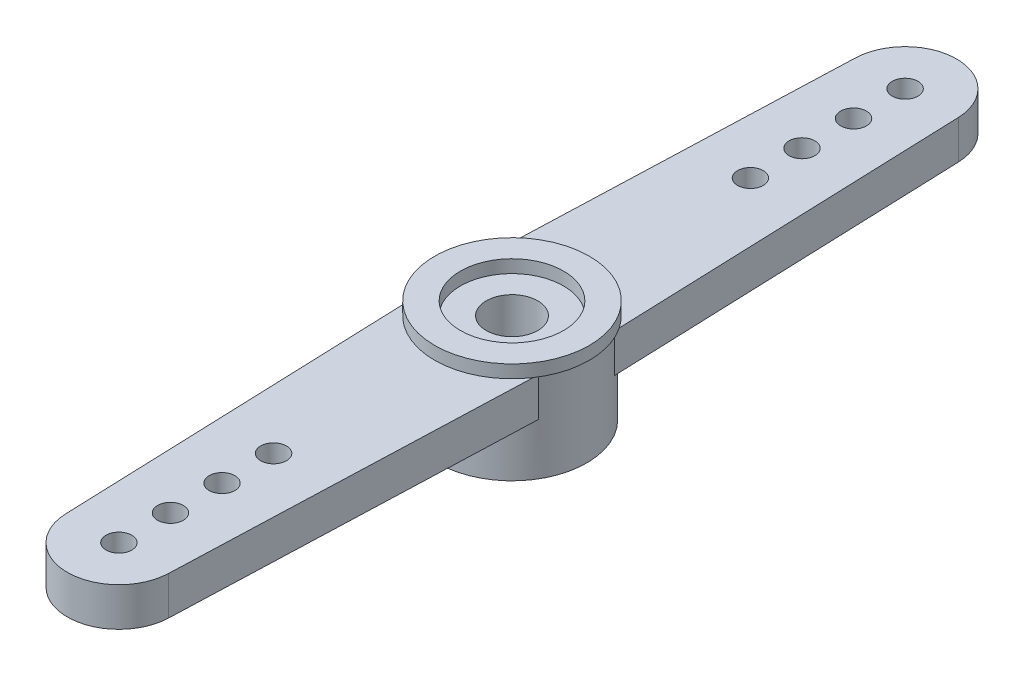
ISO-10303-21;
HEADER;
FILE_DESCRIPTION(('STEP AP214'),'2;1');
FILE_NAME('part.step','',(''),(''),'','','');
FILE_SCHEMA(('AUTOMOTIVE_DESIGN { 1 0 10303 214 1 1 1 1 }'));
ENDSEC;
DATA;
#1=APPLICATION_CONTEXT('core data for automotive mechanical design processes');
#2=APPLICATION_PROTOCOL_DEFINITION('international standard','automotive_design',2000,#1);
#3=PRODUCT_CONTEXT('',#1,'mechanical');
#4=PRODUCT('Part','Part','',(#3));
#5=PRODUCT_RELATED_PRODUCT_CATEGORY('part','',(#4));
#6=PRODUCT_DEFINITION_FORMATION('','',#4);
#7=PRODUCT_DEFINITION_CONTEXT('part definition',#1,'design');
#8=PRODUCT_DEFINITION('design','',#6,#7);
#9=PRODUCT_DEFINITION_SHAPE('','',#8);
#10=(LENGTH_UNIT() NAMED_UNIT(*) SI_UNIT(.MILLI.,.METRE.));
#11=(NAMED_UNIT(*) PLANE_ANGLE_UNIT() SI_UNIT($,.RADIAN.));
#12=(NAMED_UNIT(*) SI_UNIT($,.STERADIAN.) SOLID_ANGLE_UNIT());
#13=UNCERTAINTY_MEASURE_WITH_UNIT(LENGTH_MEASURE(1.E-05),#10,'distance_accuracy_value','');
#14=(GEOMETRIC_REPRESENTATION_CONTEXT(3) GLOBAL_UNCERTAINTY_ASSIGNED_CONTEXT((#13)) GLOBAL_UNIT_ASSIGNED_CONTEXT((#10,
#11,#12)) REPRESENTATION_CONTEXT('',''));
#15=CARTESIAN_POINT('',(0.,0.,0.));
#16=DIRECTION('',(0.,0.,1.));
#17=DIRECTION('',(1.,0.,0.));
#18=AXIS2_PLACEMENT_3D('',#15,#16,#17);
#19=CARTESIAN_POINT('',(0.,1.5,0.));
#20=DIRECTION('',(0.,1.,0.));
#21=DIRECTION('',(0.,0.,1.));
#22=AXIS2_PLACEMENT_3D('',#19,#20,#21);
#23=PLANE('',#22);
#24=CARTESIAN_POINT('',(0.,1.5,0.));
#25=DIRECTION('',(0.,1.,0.));
#26=DIRECTION('',(0.,0.,1.));
#27=AXIS2_PLACEMENT_3D('',#24,#25,#26);
#28=CIRCLE('',#27,3.);
#29=CARTESIAN_POINT('',(2.49278221920314,1.5,-1.6691425366411));
#30=VERTEX_POINT('',#29);
#31=CARTESIAN_POINT('',(-2.49278221920314,1.5,-1.6691425366411));
#32=VERTEX_POINT('',#31);
#33=EDGE_CURVE('E11',#30,#32,#28,.T.);
#34=ORIENTED_EDGE('',*,*,#33,.F.);
#35=DIRECTION('',(-0.036164986228485,0.,-0.999345832918261));
#36=VECTOR('',#35,1.);
#37=CARTESIAN_POINT('',(1.99869166583652,1.5,-15.322329972457));
#38=LINE('',#37,#36);
#39=CARTESIAN_POINT('',(1.99869166583652,1.5,-15.322329972457));
#40=VERTEX_POINT('',#39);
#41=EDGE_CURVE('E223',#30,#40,#38,.T.);
#42=ORIENTED_EDGE('',*,*,#41,.T.);
#43=CARTESIAN_POINT('',(0.,1.5,-15.25));
#44=DIRECTION('',(0.,1.,0.));
#45=DIRECTION('',(0.,0.,1.));
#46=AXIS2_PLACEMENT_3D('',#43,#44,#45);
#47=CIRCLE('',#46,2.);
#48=CARTESIAN_POINT('',(-1.99869166583652,1.5,-15.322329972457));
#49=VERTEX_POINT('',#48);
#50=EDGE_CURVE('E226',#40,#49,#47,.T.);
#51=ORIENTED_EDGE('',*,*,#50,.T.);
#52=DIRECTION('',(-0.0361649862284847,0.,0.999345832918261));
#53=VECTOR('',#52,1.);
#54=CARTESIAN_POINT('',(-1.99869166583652,1.5,-15.322329972457));
#55=LINE('',#54,#53);
#56=EDGE_CURVE('E228',#49,#32,#55,.T.);
#57=ORIENTED_EDGE('',*,*,#56,.T.);
#58=EDGE_LOOP('',(#34,#42,#51,#57));
#59=FACE_BOUND('',#58,.T.);
#60=CARTESIAN_POINT('',(0.,1.5,-9.25));
#61=DIRECTION('',(0.,1.,0.));
#62=DIRECTION('',(0.,0.,1.));
#63=AXIS2_PLACEMENT_3D('',#60,#61,#62);
#64=CIRCLE('',#63,0.5);
#65=CARTESIAN_POINT('',(0.,1.5,-8.75));
#66=VERTEX_POINT('',#65);
#67=EDGE_CURVE('E189',#66,#66,#64,.T.);
#68=ORIENTED_EDGE('',*,*,#67,.F.);
#69=EDGE_LOOP('',(#68));
#70=FACE_BOUND('',#69,.T.);
#71=CARTESIAN_POINT('',(0.,1.5,-11.25));
#72=DIRECTION('',(0.,1.,0.));
#73=DIRECTION('',(0.,0.,1.));
#74=AXIS2_PLACEMENT_3D('',#71,#72,#73);
#75=CIRCLE('',#74,0.5);
#76=CARTESIAN_POINT('',(0.,1.5,-10.75));
#77=VERTEX_POINT('',#76);
#78=EDGE_CURVE('E195',#77,#77,#75,.T.);
#79=ORIENTED_EDGE('',*,*,#78,.F.);
#80=EDGE_LOOP('',(#79));
#81=FACE_BOUND('',#80,.T.);
#82=CARTESIAN_POINT('',(0.,1.5,-13.25));
#83=DIRECTION('',(0.,1.,0.));
#84=DIRECTION('',(0.,0.,1.));
#85=AXIS2_PLACEMENT_3D('',#82,#83,#84);
#86=CIRCLE('',#85,0.5);
#87=CARTESIAN_POINT('',(0.,1.5,-12.75));
#88=VERTEX_POINT('',#87);
#89=EDGE_CURVE('E201',#88,#88,#86,.T.);
#90=ORIENTED_EDGE('',*,*,#89,.F.);
#91=EDGE_LOOP('',(#90));
#92=FACE_BOUND('',#91,.T.);
#93=CARTESIAN_POINT('',(0.,1.5,-15.25));
#94=DIRECTION('',(0.,1.,0.));
#95=DIRECTION('',(0.,0.,1.));
#96=AXIS2_PLACEMENT_3D('',#93,#94,#95);
#97=CIRCLE('',#96,0.5);
#98=CARTESIAN_POINT('',(0.,1.5,-14.75));
#99=VERTEX_POINT('',#98);
#100=EDGE_CURVE('E207',#99,#99,#97,.T.);
#101=ORIENTED_EDGE('',*,*,#100,.F.);
#102=EDGE_LOOP('',(#101));
#103=FACE_BOUND('',#102,.T.);
#104=ADVANCED_FACE('F39',(#59,#70,#81,#92,#103),#23,.T.);
#105=CARTESIAN_POINT('',(0.,1.5,0.));
#106=DIRECTION('',(0.,1.,0.));
#107=DIRECTION('',(0.,0.,1.));
#108=AXIS2_PLACEMENT_3D('',#105,#106,#107);
#109=CIRCLE('',#108,1.);
#110=CARTESIAN_POINT('',(0.,1.5,1.));
#111=VERTEX_POINT('',#110);
#112=EDGE_CURVE('E214',#111,#111,#109,.T.);
#113=ORIENTED_EDGE('',*,*,#112,.F.);
#114=EDGE_LOOP('',(#113));
#115=FACE_BOUND('',#114,.T.);
#116=CARTESIAN_POINT('',(0.,1.5,0.));
#117=DIRECTION('',(0.,1.,0.));
#118=DIRECTION('',(0.,0.,1.));
#119=AXIS2_PLACEMENT_3D('',#116,#117,#118);
#120=CIRCLE('',#119,2.);
#121=CARTESIAN_POINT('',(0.,1.5,2.));
#122=VERTEX_POINT('',#121);
#123=EDGE_CURVE('E538',#122,#122,#120,.T.);
#124=ORIENTED_EDGE('',*,*,#123,.T.);
#125=EDGE_LOOP('',(#124));
#126=FACE_BOUND('',#125,.T.);
#127=ADVANCED_FACE('F287',(#115,#126),#23,.T.);
#128=CARTESIAN_POINT('',(0.,-2.,0.));
#129=DIRECTION('',(0.,1.,0.));
#130=DIRECTION('',(0.,0.,1.));
#131=AXIS2_PLACEMENT_3D('',#128,#129,#130);
#132=CYLINDRICAL_SURFACE('',#131,2.9);
#133=DIRECTION('',(0.,-1.,0.));
#134=VECTOR('',#133,1.);
#135=CARTESIAN_POINT('',(2.5,1.5,1.46969384566991));
#136=LINE('',#135,#134);
#137=CARTESIAN_POINT('',(2.5,1.5,1.46969384566991));
#138=VERTEX_POINT('',#137);
#139=CARTESIAN_POINT('',(2.5,0.,1.46969384566991));
#140=VERTEX_POINT('',#139);
#141=EDGE_CURVE('E126',#138,#140,#136,.T.);
#142=ORIENTED_EDGE('',*,*,#141,.T.);
#143=CARTESIAN_POINT('',(0.,0.,0.));
#144=DIRECTION('',(0.,1.,0.));
#145=DIRECTION('',(0.,0.,1.));
#146=AXIS2_PLACEMENT_3D('',#143,#144,#145);
#147=CIRCLE('',#146,2.9);
#148=CARTESIAN_POINT('',(-2.5,0.,1.46969384566991));
#149=VERTEX_POINT('',#148);
#150=EDGE_CURVE('E186',#140,#149,#147,.F.);
#151=ORIENTED_EDGE('',*,*,#150,.T.);
#152=DIRECTION('',(0.,-1.,0.));
#153=VECTOR('',#152,1.);
#154=CARTESIAN_POINT('',(-2.5,1.5,1.46969384566991));
#155=LINE('',#154,#153);
#156=CARTESIAN_POINT('',(-2.5,1.5,1.46969384566991));
#157=VERTEX_POINT('',#156);
#158=EDGE_CURVE('E183',#157,#149,#155,.T.);
#159=ORIENTED_EDGE('',*,*,#158,.F.);
#160=CARTESIAN_POINT('',(0.,1.5,0.));
#161=DIRECTION('',(0.,1.,0.));
#162=DIRECTION('',(0.,0.,1.));
#163=AXIS2_PLACEMENT_3D('',#160,#161,#162);
#164=CIRCLE('',#163,2.9);
#165=CARTESIAN_POINT('',(-2.5,1.5,-1.46969384566991));
#166=VERTEX_POINT('',#165);
#167=EDGE_CURVE('E220',#166,#157,#164,.T.);
#168=ORIENTED_EDGE('',*,*,#167,.F.);
#169=DIRECTION('',(0.,-1.,0.));
#170=VECTOR('',#169,1.);
#171=CARTESIAN_POINT('',(-2.5,1.5,-1.46969384566991));
#172=LINE('',#171,#170);
#173=CARTESIAN_POINT('',(-2.5,0.,-1.46969384566991));
#174=VERTEX_POINT('',#173);
#175=EDGE_CURVE('E230',#166,#174,#172,.T.);
#176=ORIENTED_EDGE('',*,*,#175,.T.);
#177=CARTESIAN_POINT('',(0.,0.,0.));
#178=DIRECTION('',(0.,1.,0.));
#179=DIRECTION('',(0.,0.,1.));
#180=AXIS2_PLACEMENT_3D('',#177,#178,#179);
#181=CIRCLE('',#180,2.9);
#182=CARTESIAN_POINT('',(2.5,0.,-1.46969384566991));
#183=VERTEX_POINT('',#182);
#184=EDGE_CURVE('E252',#183,#174,#181,.T.);
#185=ORIENTED_EDGE('',*,*,#184,.F.);
#186=DIRECTION('',(0.,-1.,0.));
#187=VECTOR('',#186,1.);
#188=CARTESIAN_POINT('',(2.5,1.5,-1.46969384566991));
#189=LINE('',#188,#187);
#190=CARTESIAN_POINT('',(2.5,1.5,-1.46969384566991));
#191=VERTEX_POINT('',#190);
#192=EDGE_CURVE('E245',#191,#183,#189,.T.);
#193=ORIENTED_EDGE('',*,*,#192,.F.);
#194=EDGE_CURVE('E224',#138,#191,#164,.T.);
#195=ORIENTED_EDGE('',*,*,#194,.F.);
#196=EDGE_LOOP('',(#142,#151,#159,#168,#176,#185,#193,#195));
#197=FACE_BOUND('',#196,.T.);
#198=CARTESIAN_POINT('',(0.,-2.,0.));
#199=DIRECTION('',(0.,1.,0.));
#200=DIRECTION('',(0.,0.,1.));
#201=AXIS2_PLACEMENT_3D('',#198,#199,#200);
#202=CIRCLE('',#201,2.9);
#203=CARTESIAN_POINT('',(0.,-2.,2.9));
#204=VERTEX_POINT('',#203);
#205=EDGE_CURVE('E142',#204,#204,#202,.T.);
#206=ORIENTED_EDGE('',*,*,#205,.T.);
#207=EDGE_LOOP('',(#206));
#208=FACE_BOUND('',#207,.T.);
#209=ADVANCED_FACE('F41',(#197,#208),#132,.T.);
#210=CARTESIAN_POINT('',(0.,-2.,0.));
#211=DIRECTION('',(0.,1.,0.));
#212=DIRECTION('',(0.,0.,1.));
#213=AXIS2_PLACEMENT_3D('',#210,#211,#212);
#214=PLANE('',#213);
#215=CARTESIAN_POINT('',(0.,-2.,0.));
#216=DIRECTION('',(0.,1.,0.));
#217=DIRECTION('',(0.,0.,1.));
#218=AXIS2_PLACEMENT_3D('',#215,#216,#217);
#219=CIRCLE('',#218,2.);
#220=CARTESIAN_POINT('',(0.,-2.,2.));
#221=VERTEX_POINT('',#220);
#222=EDGE_CURVE('E249',#221,#221,#219,.T.);
#223=ORIENTED_EDGE('',*,*,#222,.T.);
#224=EDGE_LOOP('',(#223));
#225=FACE_BOUND('',#224,.T.);
#226=ORIENTED_EDGE('',*,*,#205,.F.);
#227=EDGE_LOOP('',(#226));
#228=FACE_BOUND('',#227,.T.);
#229=ADVANCED_FACE('F311',(#225,#228),#214,.F.);
#230=CARTESIAN_POINT('',(0.,-2.,0.));
#231=DIRECTION('',(0.,1.,0.));
#232=DIRECTION('',(0.,0.,1.));
#233=AXIS2_PLACEMENT_3D('',#230,#231,#232);
#234=CYLINDRICAL_SURFACE('',#233,2.);
#235=ORIENTED_EDGE('',*,*,#222,.F.);
#236=EDGE_LOOP('',(#235));
#237=FACE_BOUND('',#236,.T.);
#238=CARTESIAN_POINT('',(0.,0.,0.));
#239=DIRECTION('',(0.,1.,0.));
#240=DIRECTION('',(0.,0.,1.));
#241=AXIS2_PLACEMENT_3D('',#238,#239,#240);
#242=CIRCLE('',#241,2.);
#243=CARTESIAN_POINT('',(0.,0.,2.));
#244=VERTEX_POINT('',#243);
#245=EDGE_CURVE('E248',#244,#244,#242,.T.);
#246=ORIENTED_EDGE('',*,*,#245,.T.);
#247=EDGE_LOOP('',(#246));
#248=FACE_BOUND('',#247,.T.);
#249=ADVANCED_FACE('F306',(#237,#248),#234,.F.);
#250=CARTESIAN_POINT('',(0.,0.,0.));
#251=DIRECTION('',(0.,1.,0.));
#252=DIRECTION('',(0.,0.,1.));
#253=AXIS2_PLACEMENT_3D('',#250,#251,#252);
#254=PLANE('',#253);
#255=CARTESIAN_POINT('',(0.,0.,-9.25));
#256=DIRECTION('',(0.,1.,0.));
#257=DIRECTION('',(0.,0.,1.));
#258=AXIS2_PLACEMENT_3D('',#255,#256,#257);
#259=CIRCLE('',#258,0.5);
#260=CARTESIAN_POINT('',(0.,0.,-8.75));
#261=VERTEX_POINT('',#260);
#262=EDGE_CURVE('E192',#261,#261,#259,.T.);
#263=ORIENTED_EDGE('',*,*,#262,.T.);
#264=EDGE_LOOP('',(#263));
#265=FACE_BOUND('',#264,.T.);
#266=CARTESIAN_POINT('',(0.,0.,-11.25));
#267=DIRECTION('',(0.,1.,0.));
#268=DIRECTION('',(0.,0.,1.));
#269=AXIS2_PLACEMENT_3D('',#266,#267,#268);
#270=CIRCLE('',#269,0.5);
#271=CARTESIAN_POINT('',(0.,0.,-10.75));
#272=VERTEX_POINT('',#271);
#273=EDGE_CURVE('E198',#272,#272,#270,.T.);
#274=ORIENTED_EDGE('',*,*,#273,.T.);
#275=EDGE_LOOP('',(#274));
#276=FACE_BOUND('',#275,.T.);
#277=CARTESIAN_POINT('',(0.,0.,-13.25));
#278=DIRECTION('',(0.,1.,0.));
#279=DIRECTION('',(0.,0.,1.));
#280=AXIS2_PLACEMENT_3D('',#277,#278,#279);
#281=CIRCLE('',#280,0.5);
#282=CARTESIAN_POINT('',(0.,0.,-12.75));
#283=VERTEX_POINT('',#282);
#284=EDGE_CURVE('E204',#283,#283,#281,.T.);
#285=ORIENTED_EDGE('',*,*,#284,.T.);
#286=EDGE_LOOP('',(#285));
#287=FACE_BOUND('',#286,.T.);
#288=CARTESIAN_POINT('',(0.,0.,-15.25));
#289=DIRECTION('',(0.,1.,0.));
#290=DIRECTION('',(0.,0.,1.));
#291=AXIS2_PLACEMENT_3D('',#288,#289,#290);
#292=CIRCLE('',#291,0.5);
#293=CARTESIAN_POINT('',(0.,0.,-14.75));
#294=VERTEX_POINT('',#293);
#295=EDGE_CURVE('E210',#294,#294,#292,.T.);
#296=ORIENTED_EDGE('',*,*,#295,.T.);
#297=EDGE_LOOP('',(#296));
#298=FACE_BOUND('',#297,.T.);
#299=DIRECTION('',(-0.036164986228485,0.,-0.999345832918261));
#300=VECTOR('',#299,1.);
#301=CARTESIAN_POINT('',(1.99869166583652,0.,-15.322329972457));
#302=LINE('',#301,#300);
#303=CARTESIAN_POINT('',(1.99869166583652,0.,-15.322329972457));
#304=VERTEX_POINT('',#303);
#305=EDGE_CURVE('E217',#183,#304,#302,.T.);
#306=ORIENTED_EDGE('',*,*,#305,.F.);
#307=ORIENTED_EDGE('',*,*,#184,.T.);
#308=DIRECTION('',(-0.0361649862284847,0.,0.999345832918261));
#309=VECTOR('',#308,1.);
#310=CARTESIAN_POINT('',(-1.99869166583652,0.,-15.322329972457));
#311=LINE('',#310,#309);
#312=CARTESIAN_POINT('',(-1.99869166583652,0.,-15.322329972457));
#313=VERTEX_POINT('',#312);
#314=EDGE_CURVE('E234',#313,#174,#311,.T.);
#315=ORIENTED_EDGE('',*,*,#314,.F.);
#316=CARTESIAN_POINT('',(0.,0.,-15.25));
#317=DIRECTION('',(0.,1.,0.));
#318=DIRECTION('',(0.,0.,1.));
#319=AXIS2_PLACEMENT_3D('',#316,#317,#318);
#320=CIRCLE('',#319,2.);
#321=EDGE_CURVE('E232',#304,#313,#320,.T.);
#322=ORIENTED_EDGE('',*,*,#321,.F.);
#323=EDGE_LOOP('',(#306,#307,#315,#322));
#324=FACE_BOUND('',#323,.T.);
#325=ADVANCED_FACE('F299',(#265,#276,#287,#298,#324),#254,.F.);
#326=CARTESIAN_POINT('',(-2.49278221920314,1.5,1.6691425366411));
#327=VERTEX_POINT('',#326);
#328=CARTESIAN_POINT('',(2.49278221920314,1.5,1.6691425366411));
#329=VERTEX_POINT('',#328);
#330=EDGE_CURVE('E48',#327,#329,#28,.T.);
#331=ORIENTED_EDGE('',*,*,#330,.F.);
#332=DIRECTION('',(0.036164986228485,0.,0.999345832918261));
#333=VECTOR('',#332,1.);
#334=CARTESIAN_POINT('',(-1.99869166583652,1.5,15.322329972457));
#335=LINE('',#334,#333);
#336=CARTESIAN_POINT('',(-1.99869166583652,1.5,15.322329972457));
#337=VERTEX_POINT('',#336);
#338=EDGE_CURVE('E169',#327,#337,#335,.T.);
#339=ORIENTED_EDGE('',*,*,#338,.T.);
#340=CARTESIAN_POINT('',(0.,1.5,15.25));
#341=DIRECTION('',(0.,1.,0.));
#342=DIRECTION('',(0.,0.,-1.));
#343=AXIS2_PLACEMENT_3D('',#340,#341,#342);
#344=CIRCLE('',#343,2.);
#345=CARTESIAN_POINT('',(1.99869166583652,1.5,15.322329972457));
#346=VERTEX_POINT('',#345);
#347=EDGE_CURVE('E122',#337,#346,#344,.T.);
#348=ORIENTED_EDGE('',*,*,#347,.T.);
#349=DIRECTION('',(0.0361649862284847,0.,-0.999345832918261));
#350=VECTOR('',#349,1.);
#351=CARTESIAN_POINT('',(1.99869166583652,1.5,15.322329972457));
#352=LINE('',#351,#350);
#353=EDGE_CURVE('E117',#346,#329,#352,.T.);
#354=ORIENTED_EDGE('',*,*,#353,.T.);
#355=EDGE_LOOP('',(#331,#339,#348,#354));
#356=FACE_BOUND('',#355,.T.);
#357=CARTESIAN_POINT('',(0.,1.5,13.25));
#358=DIRECTION('',(0.,1.,0.));
#359=DIRECTION('',(0.,0.,-1.));
#360=AXIS2_PLACEMENT_3D('',#357,#358,#359);
#361=CIRCLE('',#360,0.5);
#362=CARTESIAN_POINT('',(0.,1.5,12.75));
#363=VERTEX_POINT('',#362);
#364=EDGE_CURVE('E153',#363,#363,#361,.T.);
#365=ORIENTED_EDGE('',*,*,#364,.F.);
#366=EDGE_LOOP('',(#365));
#367=FACE_BOUND('',#366,.T.);
#368=CARTESIAN_POINT('',(0.,1.5,11.25));
#369=DIRECTION('',(0.,1.,0.));
#370=DIRECTION('',(0.,0.,-1.));
#371=AXIS2_PLACEMENT_3D('',#368,#369,#370);
#372=CIRCLE('',#371,0.5);
#373=CARTESIAN_POINT('',(0.,1.5,10.75));
#374=VERTEX_POINT('',#373);
#375=EDGE_CURVE('E157',#374,#374,#372,.T.);
#376=ORIENTED_EDGE('',*,*,#375,.F.);
#377=EDGE_LOOP('',(#376));
#378=FACE_BOUND('',#377,.T.);
#379=CARTESIAN_POINT('',(0.,1.5,9.25));
#380=DIRECTION('',(0.,1.,0.));
#381=DIRECTION('',(0.,0.,-1.));
#382=AXIS2_PLACEMENT_3D('',#379,#380,#381);
#383=CIRCLE('',#382,0.5);
#384=CARTESIAN_POINT('',(0.,1.5,8.75));
#385=VERTEX_POINT('',#384);
#386=EDGE_CURVE('E148',#385,#385,#383,.T.);
#387=ORIENTED_EDGE('',*,*,#386,.F.);
#388=EDGE_LOOP('',(#387));
#389=FACE_BOUND('',#388,.T.);
#390=CARTESIAN_POINT('',(0.,1.5,15.25));
#391=DIRECTION('',(0.,1.,0.));
#392=DIRECTION('',(0.,0.,-1.));
#393=AXIS2_PLACEMENT_3D('',#390,#391,#392);
#394=CIRCLE('',#393,0.5);
#395=CARTESIAN_POINT('',(0.,1.5,14.75));
#396=VERTEX_POINT('',#395);
#397=EDGE_CURVE('E162',#396,#396,#394,.T.);
#398=ORIENTED_EDGE('',*,*,#397,.F.);
#399=EDGE_LOOP('',(#398));
#400=FACE_BOUND('',#399,.T.);
#401=ADVANCED_FACE('F119',(#356,#367,#378,#389,#400),#23,.T.);
#402=ORIENTED_EDGE('',*,*,#245,.F.);
#403=EDGE_LOOP('',(#402));
#404=FACE_BOUND('',#403,.T.);
#405=CARTESIAN_POINT('',(0.,0.,0.));
#406=DIRECTION('',(0.,1.,0.));
#407=DIRECTION('',(0.,0.,1.));
#408=AXIS2_PLACEMENT_3D('',#405,#406,#407);
#409=CIRCLE('',#408,1.);
#410=CARTESIAN_POINT('',(0.,0.,1.));
#411=VERTEX_POINT('',#410);
#412=EDGE_CURVE('E213',#411,#411,#409,.T.);
#413=ORIENTED_EDGE('',*,*,#412,.T.);
#414=EDGE_LOOP('',(#413));
#415=FACE_BOUND('',#414,.T.);
#416=ADVANCED_FACE('F298',(#404,#415),#254,.F.);
#417=CARTESIAN_POINT('',(1.99869166583652,1.5,-15.322329972457));
#418=DIRECTION('',(-0.999345832918261,0.,0.036164986228485));
#419=DIRECTION('',(0.036164986228485,0.,0.999345832918261));
#420=AXIS2_PLACEMENT_3D('',#417,#418,#419);
#421=PLANE('',#420);
#422=ORIENTED_EDGE('',*,*,#305,.T.);
#423=DIRECTION('',(0.,-1.,0.));
#424=VECTOR('',#423,1.);
#425=CARTESIAN_POINT('',(1.99869166583652,1.5,-15.322329972457));
#426=LINE('',#425,#424);
#427=EDGE_CURVE('E242',#40,#304,#426,.T.);
#428=ORIENTED_EDGE('',*,*,#427,.F.);
#429=ORIENTED_EDGE('',*,*,#41,.F.);
#430=EDGE_CURVE('E145',#191,#30,#38,.T.);
#431=ORIENTED_EDGE('',*,*,#430,.F.);
#432=ORIENTED_EDGE('',*,*,#192,.T.);
#433=EDGE_LOOP('',(#422,#428,#429,#431,#432));
#434=FACE_BOUND('',#433,.T.);
#435=ADVANCED_FACE('F304',(#434),#421,.F.);
#436=CARTESIAN_POINT('',(0.,1.5,-15.25));
#437=DIRECTION('',(0.,-1.,0.));
#438=DIRECTION('',(0.,0.,-1.));
#439=AXIS2_PLACEMENT_3D('',#436,#437,#438);
#440=CYLINDRICAL_SURFACE('',#439,2.);
#441=ORIENTED_EDGE('',*,*,#321,.T.);
#442=DIRECTION('',(0.,-1.,0.));
#443=VECTOR('',#442,1.);
#444=CARTESIAN_POINT('',(-1.99869166583652,1.5,-15.322329972457));
#445=LINE('',#444,#443);
#446=EDGE_CURVE('E239',#49,#313,#445,.T.);
#447=ORIENTED_EDGE('',*,*,#446,.F.);
#448=ORIENTED_EDGE('',*,*,#50,.F.);
#449=ORIENTED_EDGE('',*,*,#427,.T.);
#450=EDGE_LOOP('',(#441,#447,#448,#449));
#451=FACE_BOUND('',#450,.T.);
#452=ADVANCED_FACE('F320',(#451),#440,.T.);
#453=CARTESIAN_POINT('',(-1.99869166583652,1.5,-15.322329972457));
#454=DIRECTION('',(0.999345832918261,0.,0.0361649862284847));
#455=DIRECTION('',(0.0361649862284847,0.,-0.999345832918261));
#456=AXIS2_PLACEMENT_3D('',#453,#454,#455);
#457=PLANE('',#456);
#458=ORIENTED_EDGE('',*,*,#314,.T.);
#459=ORIENTED_EDGE('',*,*,#175,.F.);
#460=EDGE_CURVE('E64',#32,#166,#55,.T.);
#461=ORIENTED_EDGE('',*,*,#460,.F.);
#462=ORIENTED_EDGE('',*,*,#56,.F.);
#463=ORIENTED_EDGE('',*,*,#446,.T.);
#464=EDGE_LOOP('',(#458,#459,#461,#462,#463));
#465=FACE_BOUND('',#464,.T.);
#466=ADVANCED_FACE('F316',(#465),#457,.F.);
#467=CARTESIAN_POINT('',(0.,1.5,0.));
#468=DIRECTION('',(0.,-1.,0.));
#469=DIRECTION('',(0.,0.,-1.));
#470=AXIS2_PLACEMENT_3D('',#467,#468,#469);
#471=CYLINDRICAL_SURFACE('',#470,1.);
#472=ORIENTED_EDGE('',*,*,#112,.T.);
#473=EDGE_LOOP('',(#472));
#474=FACE_BOUND('',#473,.T.);
#475=ORIENTED_EDGE('',*,*,#412,.F.);
#476=EDGE_LOOP('',(#475));
#477=FACE_BOUND('',#476,.T.);
#478=ADVANCED_FACE('F319',(#474,#477),#471,.F.);
#479=CARTESIAN_POINT('',(0.,-2.,-15.25));
#480=DIRECTION('',(0.,1.,0.));
#481=DIRECTION('',(0.,0.,1.));
#482=AXIS2_PLACEMENT_3D('',#479,#480,#481);
#483=CYLINDRICAL_SURFACE('',#482,0.5);
#484=ORIENTED_EDGE('',*,*,#100,.T.);
#485=EDGE_LOOP('',(#484));
#486=FACE_BOUND('',#485,.T.);
#487=ORIENTED_EDGE('',*,*,#295,.F.);
#488=EDGE_LOOP('',(#487));
#489=FACE_BOUND('',#488,.T.);
#490=ADVANCED_FACE('F342',(#486,#489),#483,.F.);
#491=CARTESIAN_POINT('',(0.,-2.,-13.25));
#492=DIRECTION('',(0.,1.,0.));
#493=DIRECTION('',(0.,0.,1.));
#494=AXIS2_PLACEMENT_3D('',#491,#492,#493);
#495=CYLINDRICAL_SURFACE('',#494,0.5);
#496=ORIENTED_EDGE('',*,*,#89,.T.);
#497=EDGE_LOOP('',(#496));
#498=FACE_BOUND('',#497,.T.);
#499=ORIENTED_EDGE('',*,*,#284,.F.);
#500=EDGE_LOOP('',(#499));
#501=FACE_BOUND('',#500,.T.);
#502=ADVANCED_FACE('F347',(#498,#501),#495,.F.);
#503=CARTESIAN_POINT('',(0.,-2.,-11.25));
#504=DIRECTION('',(0.,1.,0.));
#505=DIRECTION('',(0.,0.,1.));
#506=AXIS2_PLACEMENT_3D('',#503,#504,#505);
#507=CYLINDRICAL_SURFACE('',#506,0.5);
#508=ORIENTED_EDGE('',*,*,#78,.T.);
#509=EDGE_LOOP('',(#508));
#510=FACE_BOUND('',#509,.T.);
#511=ORIENTED_EDGE('',*,*,#273,.F.);
#512=EDGE_LOOP('',(#511));
#513=FACE_BOUND('',#512,.T.);
#514=ADVANCED_FACE('F353',(#510,#513),#507,.F.);
#515=CARTESIAN_POINT('',(0.,-2.,-9.25));
#516=DIRECTION('',(0.,1.,0.));
#517=DIRECTION('',(0.,0.,1.));
#518=AXIS2_PLACEMENT_3D('',#515,#516,#517);
#519=CYLINDRICAL_SURFACE('',#518,0.5);
#520=ORIENTED_EDGE('',*,*,#67,.T.);
#521=EDGE_LOOP('',(#520));
#522=FACE_BOUND('',#521,.T.);
#523=ORIENTED_EDGE('',*,*,#262,.F.);
#524=EDGE_LOOP('',(#523));
#525=FACE_BOUND('',#524,.T.);
#526=ADVANCED_FACE('F357',(#522,#525),#519,.F.);
#527=CARTESIAN_POINT('',(0.,0.,0.));
#528=DIRECTION('',(0.,1.,0.));
#529=DIRECTION('',(0.,0.,-1.));
#530=AXIS2_PLACEMENT_3D('',#527,#528,#529);
#531=PLANE('',#530);
#532=CARTESIAN_POINT('',(0.,0.,13.25));
#533=DIRECTION('',(0.,1.,0.));
#534=DIRECTION('',(0.,0.,1.));
#535=AXIS2_PLACEMENT_3D('',#532,#533,#534);
#536=CIRCLE('',#535,0.5);
#537=CARTESIAN_POINT('',(0.,0.,13.75));
#538=VERTEX_POINT('',#537);
#539=EDGE_CURVE('E43',#538,#538,#536,.T.);
#540=ORIENTED_EDGE('',*,*,#539,.T.);
#541=EDGE_LOOP('',(#540));
#542=FACE_BOUND('',#541,.T.);
#543=CARTESIAN_POINT('',(0.,0.,11.25));
#544=DIRECTION('',(0.,1.,0.));
#545=DIRECTION('',(0.,0.,1.));
#546=AXIS2_PLACEMENT_3D('',#543,#544,#545);
#547=CIRCLE('',#546,0.5);
#548=CARTESIAN_POINT('',(0.,0.,11.75));
#549=VERTEX_POINT('',#548);
#550=EDGE_CURVE('E261',#549,#549,#547,.T.);
#551=ORIENTED_EDGE('',*,*,#550,.T.);
#552=EDGE_LOOP('',(#551));
#553=FACE_BOUND('',#552,.T.);
#554=CARTESIAN_POINT('',(0.,0.,9.25));
#555=DIRECTION('',(0.,1.,0.));
#556=DIRECTION('',(0.,0.,1.));
#557=AXIS2_PLACEMENT_3D('',#554,#555,#556);
#558=CIRCLE('',#557,0.5);
#559=CARTESIAN_POINT('',(0.,0.,9.75));
#560=VERTEX_POINT('',#559);
#561=EDGE_CURVE('E156',#560,#560,#558,.T.);
#562=ORIENTED_EDGE('',*,*,#561,.T.);
#563=EDGE_LOOP('',(#562));
#564=FACE_BOUND('',#563,.T.);
#565=CARTESIAN_POINT('',(0.,0.,15.25));
#566=DIRECTION('',(0.,1.,0.));
#567=DIRECTION('',(0.,0.,1.));
#568=AXIS2_PLACEMENT_3D('',#565,#566,#567);
#569=CIRCLE('',#568,0.5);
#570=CARTESIAN_POINT('',(0.,0.,15.75));
#571=VERTEX_POINT('',#570);
#572=EDGE_CURVE('E165',#571,#571,#569,.T.);
#573=ORIENTED_EDGE('',*,*,#572,.T.);
#574=EDGE_LOOP('',(#573));
#575=FACE_BOUND('',#574,.T.);
#576=ORIENTED_EDGE('',*,*,#150,.F.);
#577=DIRECTION('',(0.0361649862284847,0.,-0.999345832918261));
#578=VECTOR('',#577,1.);
#579=CARTESIAN_POINT('',(1.99869166583652,0.,15.322329972457));
#580=LINE('',#579,#578);
#581=CARTESIAN_POINT('',(1.99869166583652,0.,15.322329972457));
#582=VERTEX_POINT('',#581);
#583=EDGE_CURVE('E175',#582,#140,#580,.T.);
#584=ORIENTED_EDGE('',*,*,#583,.F.);
#585=CARTESIAN_POINT('',(0.,0.,15.25));
#586=DIRECTION('',(0.,1.,0.));
#587=DIRECTION('',(0.,0.,-1.));
#588=AXIS2_PLACEMENT_3D('',#585,#586,#587);
#589=CIRCLE('',#588,2.);
#590=CARTESIAN_POINT('',(-1.99869166583652,0.,15.322329972457));
#591=VERTEX_POINT('',#590);
#592=EDGE_CURVE('E173',#591,#582,#589,.T.);
#593=ORIENTED_EDGE('',*,*,#592,.F.);
#594=DIRECTION('',(0.036164986228485,0.,0.999345832918261));
#595=VECTOR('',#594,1.);
#596=CARTESIAN_POINT('',(-1.99869166583652,0.,15.322329972457));
#597=LINE('',#596,#595);
#598=EDGE_CURVE('E171',#149,#591,#597,.T.);
#599=ORIENTED_EDGE('',*,*,#598,.F.);
#600=EDGE_LOOP('',(#576,#584,#593,#599));
#601=FACE_BOUND('',#600,.T.);
#602=ADVANCED_FACE('F268',(#542,#553,#564,#575,#601),#531,.F.);
#603=CARTESIAN_POINT('',(-1.99869166583652,1.5,15.322329972457));
#604=DIRECTION('',(0.999345832918261,0.,-0.036164986228485));
#605=DIRECTION('',(-0.036164986228485,0.,-0.999345832918261));
#606=AXIS2_PLACEMENT_3D('',#603,#604,#605);
#607=PLANE('',#606);
#608=ORIENTED_EDGE('',*,*,#598,.T.);
#609=DIRECTION('',(0.,-1.,0.));
#610=VECTOR('',#609,1.);
#611=CARTESIAN_POINT('',(-1.99869166583652,1.5,15.322329972457));
#612=LINE('',#611,#610);
#613=EDGE_CURVE('E180',#337,#591,#612,.T.);
#614=ORIENTED_EDGE('',*,*,#613,.F.);
#615=ORIENTED_EDGE('',*,*,#338,.F.);
#616=EDGE_CURVE('E166',#157,#327,#335,.T.);
#617=ORIENTED_EDGE('',*,*,#616,.F.);
#618=ORIENTED_EDGE('',*,*,#158,.T.);
#619=EDGE_LOOP('',(#608,#614,#615,#617,#618));
#620=FACE_BOUND('',#619,.T.);
#621=ADVANCED_FACE('F362',(#620),#607,.F.);
#622=CARTESIAN_POINT('',(0.,1.5,15.25));
#623=DIRECTION('',(0.,-1.,0.));
#624=DIRECTION('',(0.,0.,-1.));
#625=AXIS2_PLACEMENT_3D('',#622,#623,#624);
#626=CYLINDRICAL_SURFACE('',#625,2.);
#627=ORIENTED_EDGE('',*,*,#592,.T.);
#628=DIRECTION('',(0.,-1.,0.));
#629=VECTOR('',#628,1.);
#630=CARTESIAN_POINT('',(1.99869166583652,1.5,15.322329972457));
#631=LINE('',#630,#629);
#632=EDGE_CURVE('E178',#346,#582,#631,.T.);
#633=ORIENTED_EDGE('',*,*,#632,.F.);
#634=ORIENTED_EDGE('',*,*,#347,.F.);
#635=ORIENTED_EDGE('',*,*,#613,.T.);
#636=EDGE_LOOP('',(#627,#633,#634,#635));
#637=FACE_BOUND('',#636,.T.);
#638=ADVANCED_FACE('F365',(#637),#626,.T.);
#639=CARTESIAN_POINT('',(1.99869166583652,1.5,15.322329972457));
#640=DIRECTION('',(-0.999345832918261,0.,-0.0361649862284847));
#641=DIRECTION('',(-0.0361649862284847,0.,0.999345832918261));
#642=AXIS2_PLACEMENT_3D('',#639,#640,#641);
#643=PLANE('',#642);
#644=ORIENTED_EDGE('',*,*,#583,.T.);
#645=ORIENTED_EDGE('',*,*,#141,.F.);
#646=EDGE_CURVE('E127',#329,#138,#352,.T.);
#647=ORIENTED_EDGE('',*,*,#646,.F.);
#648=ORIENTED_EDGE('',*,*,#353,.F.);
#649=ORIENTED_EDGE('',*,*,#632,.T.);
#650=EDGE_LOOP('',(#644,#645,#647,#648,#649));
#651=FACE_BOUND('',#650,.T.);
#652=ADVANCED_FACE('F130',(#651),#643,.F.);
#653=CARTESIAN_POINT('',(0.,-2.,15.25));
#654=DIRECTION('',(0.,1.,0.));
#655=DIRECTION('',(0.,0.,1.));
#656=AXIS2_PLACEMENT_3D('',#653,#654,#655);
#657=CYLINDRICAL_SURFACE('',#656,0.5);
#658=ORIENTED_EDGE('',*,*,#397,.T.);
#659=EDGE_LOOP('',(#658));
#660=FACE_BOUND('',#659,.T.);
#661=ORIENTED_EDGE('',*,*,#572,.F.);
#662=EDGE_LOOP('',(#661));
#663=FACE_BOUND('',#662,.T.);
#664=ADVANCED_FACE('F372',(#660,#663),#657,.F.);
#665=CARTESIAN_POINT('',(0.,-2.,9.25));
#666=DIRECTION('',(0.,1.,0.));
#667=DIRECTION('',(0.,0.,1.));
#668=AXIS2_PLACEMENT_3D('',#665,#666,#667);
#669=CYLINDRICAL_SURFACE('',#668,0.5);
#670=ORIENTED_EDGE('',*,*,#386,.T.);
#671=EDGE_LOOP('',(#670));
#672=FACE_BOUND('',#671,.T.);
#673=ORIENTED_EDGE('',*,*,#561,.F.);
#674=EDGE_LOOP('',(#673));
#675=FACE_BOUND('',#674,.T.);
#676=ADVANCED_FACE('F282',(#672,#675),#669,.F.);
#677=CARTESIAN_POINT('',(0.,-2.,11.25));
#678=DIRECTION('',(0.,1.,0.));
#679=DIRECTION('',(0.,0.,1.));
#680=AXIS2_PLACEMENT_3D('',#677,#678,#679);
#681=CYLINDRICAL_SURFACE('',#680,0.5);
#682=ORIENTED_EDGE('',*,*,#375,.T.);
#683=EDGE_LOOP('',(#682));
#684=FACE_BOUND('',#683,.T.);
#685=ORIENTED_EDGE('',*,*,#550,.F.);
#686=EDGE_LOOP('',(#685));
#687=FACE_BOUND('',#686,.T.);
#688=ADVANCED_FACE('F273',(#684,#687),#681,.F.);
#689=CARTESIAN_POINT('',(0.,-2.,13.25));
#690=DIRECTION('',(0.,1.,0.));
#691=DIRECTION('',(0.,0.,1.));
#692=AXIS2_PLACEMENT_3D('',#689,#690,#691);
#693=CYLINDRICAL_SURFACE('',#692,0.5);
#694=ORIENTED_EDGE('',*,*,#364,.T.);
#695=EDGE_LOOP('',(#694));
#696=FACE_BOUND('',#695,.T.);
#697=ORIENTED_EDGE('',*,*,#539,.F.);
#698=EDGE_LOOP('',(#697));
#699=FACE_BOUND('',#698,.T.);
#700=ADVANCED_FACE('F270',(#696,#699),#693,.F.);
#701=CARTESIAN_POINT('',(0.,1.5,0.));
#702=DIRECTION('',(0.,1.,0.));
#703=DIRECTION('',(0.,0.,1.));
#704=AXIS2_PLACEMENT_3D('',#701,#702,#703);
#705=PLANE('',#704);
#706=EDGE_CURVE('E50',#32,#327,#28,.T.);
#707=ORIENTED_EDGE('',*,*,#706,.F.);
#708=ORIENTED_EDGE('',*,*,#460,.T.);
#709=ORIENTED_EDGE('',*,*,#167,.T.);
#710=ORIENTED_EDGE('',*,*,#616,.T.);
#711=EDGE_LOOP('',(#707,#708,#709,#710));
#712=FACE_BOUND('',#711,.T.);
#713=ADVANCED_FACE('F272',(#712),#705,.F.);
#714=ORIENTED_EDGE('',*,*,#194,.T.);
#715=ORIENTED_EDGE('',*,*,#430,.T.);
#716=EDGE_CURVE('E140',#329,#30,#28,.T.);
#717=ORIENTED_EDGE('',*,*,#716,.F.);
#718=ORIENTED_EDGE('',*,*,#646,.T.);
#719=EDGE_LOOP('',(#714,#715,#717,#718));
#720=FACE_BOUND('',#719,.T.);
#721=ADVANCED_FACE('F144',(#720),#705,.F.);
#722=CARTESIAN_POINT('',(0.,2.,0.));
#723=DIRECTION('',(0.,1.,0.));
#724=DIRECTION('',(0.,0.,1.));
#725=AXIS2_PLACEMENT_3D('',#722,#723,#724);
#726=PLANE('',#725);
#727=CARTESIAN_POINT('',(0.,2.,0.));
#728=DIRECTION('',(0.,1.,0.));
#729=DIRECTION('',(0.,0.,1.));
#730=AXIS2_PLACEMENT_3D('',#727,#728,#729);
#731=CIRCLE('',#730,3.);
#732=CARTESIAN_POINT('',(0.,2.,3.));
#733=VERTEX_POINT('',#732);
#734=EDGE_CURVE('E146',#733,#733,#731,.T.);
#735=ORIENTED_EDGE('',*,*,#734,.T.);
#736=EDGE_LOOP('',(#735));
#737=FACE_BOUND('',#736,.T.);
#738=CARTESIAN_POINT('',(0.,2.,0.));
#739=DIRECTION('',(0.,1.,0.));
#740=DIRECTION('',(0.,0.,1.));
#741=AXIS2_PLACEMENT_3D('',#738,#739,#740);
#742=CIRCLE('',#741,2.);
#743=CARTESIAN_POINT('',(0.,2.,2.));
#744=VERTEX_POINT('',#743);
#745=EDGE_CURVE('E150',#744,#744,#742,.T.);
#746=ORIENTED_EDGE('',*,*,#745,.F.);
#747=EDGE_LOOP('',(#746));
#748=FACE_BOUND('',#747,.T.);
#749=ADVANCED_FACE('F494',(#737,#748),#726,.T.);
#750=CARTESIAN_POINT('',(0.,2.,0.));
#751=DIRECTION('',(0.,-1.,0.));
#752=DIRECTION('',(0.,0.,-1.));
#753=AXIS2_PLACEMENT_3D('',#750,#751,#752);
#754=CYLINDRICAL_SURFACE('',#753,3.);
#755=ORIENTED_EDGE('',*,*,#734,.F.);
#756=EDGE_LOOP('',(#755));
#757=FACE_BOUND('',#756,.T.);
#758=ORIENTED_EDGE('',*,*,#716,.T.);
#759=ORIENTED_EDGE('',*,*,#33,.T.);
#760=ORIENTED_EDGE('',*,*,#706,.T.);
#761=ORIENTED_EDGE('',*,*,#330,.T.);
#762=EDGE_LOOP('',(#758,#759,#760,#761));
#763=FACE_BOUND('',#762,.T.);
#764=ADVANCED_FACE('F139',(#757,#763),#754,.T.);
#765=CARTESIAN_POINT('',(0.,2.,0.));
#766=DIRECTION('',(0.,-1.,0.));
#767=DIRECTION('',(0.,0.,-1.));
#768=AXIS2_PLACEMENT_3D('',#765,#766,#767);
#769=CYLINDRICAL_SURFACE('',#768,2.);
#770=ORIENTED_EDGE('',*,*,#745,.T.);
#771=EDGE_LOOP('',(#770));
#772=FACE_BOUND('',#771,.T.);
#773=ORIENTED_EDGE('',*,*,#123,.F.);
#774=EDGE_LOOP('',(#773));
#775=FACE_BOUND('',#774,.T.);
#776=ADVANCED_FACE('F513',(#772,#775),#769,.F.);
#777=CLOSED_SHELL('',(#104,#127,#209,#229,#249,#325,#401,#416,#435,#452,#466,#478,#490,#502,
#514,#526,#602,#621,#638,#652,#664,#676,#688,#700,#713,#721,#749,#764,#776));
#778=MANIFOLD_SOLID_BREP('B2',#777);
#779=ADVANCED_BREP_SHAPE_REPRESENTATION('',(#18,#778),#14);
#780=SHAPE_DEFINITION_REPRESENTATION(#9,#779);
ENDSEC;
END-ISO-10303-21;
